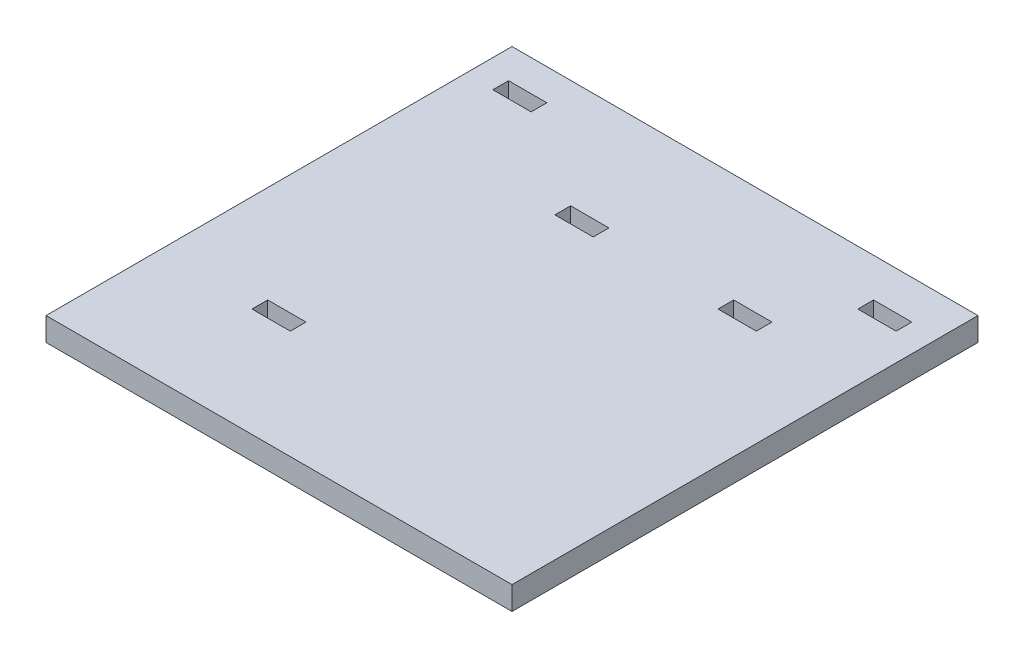
ISO-10303-21;
HEADER;
FILE_DESCRIPTION(('STEP AP214'),'2;1');
FILE_NAME('part.step','',(''),(''),'','','');
FILE_SCHEMA(('AUTOMOTIVE_DESIGN { 1 0 10303 214 1 1 1 1 }'));
ENDSEC;
DATA;
#1=APPLICATION_CONTEXT('core data for automotive mechanical design processes');
#2=APPLICATION_PROTOCOL_DEFINITION('international standard','automotive_design',2000,#1);
#3=PRODUCT_CONTEXT('',#1,'mechanical');
#4=PRODUCT('Part','Part','',(#3));
#5=PRODUCT_RELATED_PRODUCT_CATEGORY('part','',(#4));
#6=PRODUCT_DEFINITION_FORMATION('','',#4);
#7=PRODUCT_DEFINITION_CONTEXT('part definition',#1,'design');
#8=PRODUCT_DEFINITION('design','',#6,#7);
#9=PRODUCT_DEFINITION_SHAPE('','',#8);
#10=(LENGTH_UNIT() NAMED_UNIT(*) SI_UNIT(.MILLI.,.METRE.));
#11=(NAMED_UNIT(*) PLANE_ANGLE_UNIT() SI_UNIT($,.RADIAN.));
#12=(NAMED_UNIT(*) SI_UNIT($,.STERADIAN.) SOLID_ANGLE_UNIT());
#13=UNCERTAINTY_MEASURE_WITH_UNIT(LENGTH_MEASURE(1.E-05),#10,'distance_accuracy_value','');
#14=(GEOMETRIC_REPRESENTATION_CONTEXT(3) GLOBAL_UNCERTAINTY_ASSIGNED_CONTEXT((#13)) GLOBAL_UNIT_ASSIGNED_CONTEXT((#10,
#11,#12)) REPRESENTATION_CONTEXT('',''));
#15=CARTESIAN_POINT('',(0.,0.,0.));
#16=DIRECTION('',(0.,0.,1.));
#17=DIRECTION('',(1.,0.,0.));
#18=AXIS2_PLACEMENT_3D('',#15,#16,#17);
#19=CARTESIAN_POINT('',(-100.,10.,-100.));
#20=DIRECTION('',(1.,0.,0.));
#21=DIRECTION('',(0.,0.,-1.));
#22=AXIS2_PLACEMENT_3D('',#19,#20,#21);
#23=PLANE('',#22);
#24=DIRECTION('',(0.,0.,1.));
#25=VECTOR('',#24,1.);
#26=CARTESIAN_POINT('',(-100.,0.,-100.));
#27=LINE('',#26,#25);
#28=CARTESIAN_POINT('',(-100.,0.,-100.));
#29=VERTEX_POINT('',#28);
#30=CARTESIAN_POINT('',(-100.,0.,100.));
#31=VERTEX_POINT('',#30);
#32=EDGE_CURVE('E352',#29,#31,#27,.T.);
#33=ORIENTED_EDGE('',*,*,#32,.T.);
#34=DIRECTION('',(0.,-1.,0.));
#35=VECTOR('',#34,1.);
#36=CARTESIAN_POINT('',(-100.,10.,100.));
#37=LINE('',#36,#35);
#38=CARTESIAN_POINT('',(-100.,10.,100.));
#39=VERTEX_POINT('',#38);
#40=EDGE_CURVE('E11',#39,#31,#37,.T.);
#41=ORIENTED_EDGE('',*,*,#40,.F.);
#42=DIRECTION('',(0.,0.,1.));
#43=VECTOR('',#42,1.);
#44=CARTESIAN_POINT('',(-100.,10.,-100.));
#45=LINE('',#44,#43);
#46=CARTESIAN_POINT('',(-100.,10.,-100.));
#47=VERTEX_POINT('',#46);
#48=EDGE_CURVE('E359',#47,#39,#45,.T.);
#49=ORIENTED_EDGE('',*,*,#48,.F.);
#50=DIRECTION('',(0.,-1.,0.));
#51=VECTOR('',#50,1.);
#52=CARTESIAN_POINT('',(-100.,10.,-100.));
#53=LINE('',#52,#51);
#54=EDGE_CURVE('E369',#47,#29,#53,.T.);
#55=ORIENTED_EDGE('',*,*,#54,.T.);
#56=EDGE_LOOP('',(#33,#41,#49,#55));
#57=FACE_BOUND('',#56,.T.);
#58=ADVANCED_FACE('F33',(#57),#23,.F.);
#59=CARTESIAN_POINT('',(-100.,10.,100.));
#60=DIRECTION('',(0.,0.,-1.));
#61=DIRECTION('',(-1.,0.,0.));
#62=AXIS2_PLACEMENT_3D('',#59,#60,#61);
#63=PLANE('',#62);
#64=DIRECTION('',(1.,0.,0.));
#65=VECTOR('',#64,1.);
#66=CARTESIAN_POINT('',(-100.,0.,100.));
#67=LINE('',#66,#65);
#68=CARTESIAN_POINT('',(100.,0.,100.));
#69=VERTEX_POINT('',#68);
#70=EDGE_CURVE('E372',#31,#69,#67,.T.);
#71=ORIENTED_EDGE('',*,*,#70,.T.);
#72=DIRECTION('',(0.,-1.,0.));
#73=VECTOR('',#72,1.);
#74=CARTESIAN_POINT('',(100.,10.,100.));
#75=LINE('',#74,#73);
#76=CARTESIAN_POINT('',(100.,10.,100.));
#77=VERTEX_POINT('',#76);
#78=EDGE_CURVE('E40',#77,#69,#75,.T.);
#79=ORIENTED_EDGE('',*,*,#78,.F.);
#80=DIRECTION('',(1.,0.,0.));
#81=VECTOR('',#80,1.);
#82=CARTESIAN_POINT('',(-100.,10.,100.));
#83=LINE('',#82,#81);
#84=EDGE_CURVE('E362',#39,#77,#83,.T.);
#85=ORIENTED_EDGE('',*,*,#84,.F.);
#86=ORIENTED_EDGE('',*,*,#40,.T.);
#87=EDGE_LOOP('',(#71,#79,#85,#86));
#88=FACE_BOUND('',#87,.T.);
#89=ADVANCED_FACE('F401',(#88),#63,.F.);
#90=CARTESIAN_POINT('',(100.,10.,-100.));
#91=DIRECTION('',(-1.,0.,0.));
#92=DIRECTION('',(0.,0.,1.));
#93=AXIS2_PLACEMENT_3D('',#90,#91,#92);
#94=PLANE('',#93);
#95=DIRECTION('',(0.,0.,-1.));
#96=VECTOR('',#95,1.);
#97=CARTESIAN_POINT('',(100.,0.,-100.));
#98=LINE('',#97,#96);
#99=CARTESIAN_POINT('',(100.,0.,-100.));
#100=VERTEX_POINT('',#99);
#101=EDGE_CURVE('E374',#69,#100,#98,.T.);
#102=ORIENTED_EDGE('',*,*,#101,.T.);
#103=DIRECTION('',(0.,-1.,0.));
#104=VECTOR('',#103,1.);
#105=CARTESIAN_POINT('',(100.,10.,-100.));
#106=LINE('',#105,#104);
#107=CARTESIAN_POINT('',(100.,10.,-100.));
#108=VERTEX_POINT('',#107);
#109=EDGE_CURVE('E379',#108,#100,#106,.T.);
#110=ORIENTED_EDGE('',*,*,#109,.F.);
#111=DIRECTION('',(0.,0.,-1.));
#112=VECTOR('',#111,1.);
#113=CARTESIAN_POINT('',(100.,10.,-100.));
#114=LINE('',#113,#112);
#115=EDGE_CURVE('E365',#77,#108,#114,.T.);
#116=ORIENTED_EDGE('',*,*,#115,.F.);
#117=ORIENTED_EDGE('',*,*,#78,.T.);
#118=EDGE_LOOP('',(#102,#110,#116,#117));
#119=FACE_BOUND('',#118,.T.);
#120=ADVANCED_FACE('F386',(#119),#94,.F.);
#121=CARTESIAN_POINT('',(-100.,10.,-100.));
#122=DIRECTION('',(0.,0.,1.));
#123=DIRECTION('',(1.,0.,0.));
#124=AXIS2_PLACEMENT_3D('',#121,#122,#123);
#125=PLANE('',#124);
#126=DIRECTION('',(-1.,0.,0.));
#127=VECTOR('',#126,1.);
#128=CARTESIAN_POINT('',(-100.,0.,-100.));
#129=LINE('',#128,#127);
#130=EDGE_CURVE('E363',#100,#29,#129,.T.);
#131=ORIENTED_EDGE('',*,*,#130,.T.);
#132=ORIENTED_EDGE('',*,*,#54,.F.);
#133=DIRECTION('',(-1.,0.,0.));
#134=VECTOR('',#133,1.);
#135=CARTESIAN_POINT('',(-100.,10.,-100.));
#136=LINE('',#135,#134);
#137=EDGE_CURVE('E367',#108,#47,#136,.T.);
#138=ORIENTED_EDGE('',*,*,#137,.F.);
#139=ORIENTED_EDGE('',*,*,#109,.T.);
#140=EDGE_LOOP('',(#131,#132,#138,#139));
#141=FACE_BOUND('',#140,.T.);
#142=ADVANCED_FACE('F394',(#141),#125,.F.);
#143=CARTESIAN_POINT('',(0.,10.,0.));
#144=DIRECTION('',(0.,1.,0.));
#145=DIRECTION('',(0.,0.,1.));
#146=AXIS2_PLACEMENT_3D('',#143,#144,#145);
#147=PLANE('',#146);
#148=DIRECTION('',(0.,0.,1.));
#149=VECTOR('',#148,1.);
#150=CARTESIAN_POINT('',(71.7863811557623,10.,-83.3696897822514));
#151=LINE('',#150,#149);
#152=CARTESIAN_POINT('',(71.7863811557623,10.,-83.3696897822514));
#153=VERTEX_POINT('',#152);
#154=CARTESIAN_POINT('',(71.7863811557623,10.,-76.6303102177486));
#155=VERTEX_POINT('',#154);
#156=EDGE_CURVE('E47',#153,#155,#151,.T.);
#157=ORIENTED_EDGE('',*,*,#156,.F.);
#158=DIRECTION('',(-1.,0.,0.));
#159=VECTOR('',#158,1.);
#160=CARTESIAN_POINT('',(71.7863811557623,10.,-83.3696897822514));
#161=LINE('',#160,#159);
#162=CARTESIAN_POINT('',(88.2136188442377,10.,-83.3696897822514));
#163=VERTEX_POINT('',#162);
#164=EDGE_CURVE('E238',#163,#153,#161,.T.);
#165=ORIENTED_EDGE('',*,*,#164,.F.);
#166=DIRECTION('',(0.,0.,-1.));
#167=VECTOR('',#166,1.);
#168=CARTESIAN_POINT('',(88.2136188442377,10.,-83.3696897822514));
#169=LINE('',#168,#167);
#170=CARTESIAN_POINT('',(88.2136188442377,10.,-76.6303102177486));
#171=VERTEX_POINT('',#170);
#172=EDGE_CURVE('E252',#171,#163,#169,.T.);
#173=ORIENTED_EDGE('',*,*,#172,.F.);
#174=DIRECTION('',(1.,0.,0.));
#175=VECTOR('',#174,1.);
#176=CARTESIAN_POINT('',(71.7863811557623,10.,-76.6303102177486));
#177=LINE('',#176,#175);
#178=EDGE_CURVE('E249',#155,#171,#177,.T.);
#179=ORIENTED_EDGE('',*,*,#178,.F.);
#180=EDGE_LOOP('',(#157,#165,#173,#179));
#181=FACE_BOUND('',#180,.T.);
#182=DIRECTION('',(0.,0.,1.));
#183=VECTOR('',#182,1.);
#184=CARTESIAN_POINT('',(-58.2136188442377,10.,46.6303102177486));
#185=LINE('',#184,#183);
#186=CARTESIAN_POINT('',(-58.2136188442377,10.,46.6303102177486));
#187=VERTEX_POINT('',#186);
#188=CARTESIAN_POINT('',(-58.2136188442377,10.,53.3696897822514));
#189=VERTEX_POINT('',#188);
#190=EDGE_CURVE('E55',#187,#189,#185,.T.);
#191=ORIENTED_EDGE('',*,*,#190,.F.);
#192=DIRECTION('',(-1.,0.,0.));
#193=VECTOR('',#192,1.);
#194=CARTESIAN_POINT('',(-58.2136188442377,10.,46.6303102177486));
#195=LINE('',#194,#193);
#196=CARTESIAN_POINT('',(-41.7863811557623,10.,46.6303102177486));
#197=VERTEX_POINT('',#196);
#198=EDGE_CURVE('E214',#197,#187,#195,.T.);
#199=ORIENTED_EDGE('',*,*,#198,.F.);
#200=DIRECTION('',(0.,0.,-1.));
#201=VECTOR('',#200,1.);
#202=CARTESIAN_POINT('',(-41.7863811557623,10.,46.6303102177486));
#203=LINE('',#202,#201);
#204=CARTESIAN_POINT('',(-41.7863811557623,10.,53.3696897822514));
#205=VERTEX_POINT('',#204);
#206=EDGE_CURVE('E217',#205,#197,#203,.T.);
#207=ORIENTED_EDGE('',*,*,#206,.F.);
#208=DIRECTION('',(1.,0.,0.));
#209=VECTOR('',#208,1.);
#210=CARTESIAN_POINT('',(-58.2136188442377,10.,53.3696897822514));
#211=LINE('',#210,#209);
#212=EDGE_CURVE('E223',#189,#205,#211,.T.);
#213=ORIENTED_EDGE('',*,*,#212,.F.);
#214=EDGE_LOOP('',(#191,#199,#207,#213));
#215=FACE_BOUND('',#214,.T.);
#216=DIRECTION('',(0.,0.,1.));
#217=VECTOR('',#216,1.);
#218=CARTESIAN_POINT('',(41.7863811557623,10.,-53.3696897822514));
#219=LINE('',#218,#217);
#220=CARTESIAN_POINT('',(41.7863811557623,10.,-53.3696897822514));
#221=VERTEX_POINT('',#220);
#222=CARTESIAN_POINT('',(41.7863811557623,10.,-46.6303102177486));
#223=VERTEX_POINT('',#222);
#224=EDGE_CURVE('E230',#221,#223,#219,.T.);
#225=ORIENTED_EDGE('',*,*,#224,.F.);
#226=DIRECTION('',(-1.,0.,0.));
#227=VECTOR('',#226,1.);
#228=CARTESIAN_POINT('',(41.7863811557623,10.,-53.3696897822514));
#229=LINE('',#228,#227);
#230=CARTESIAN_POINT('',(58.2136188442377,10.,-53.3696897822514));
#231=VERTEX_POINT('',#230);
#232=EDGE_CURVE('E267',#231,#221,#229,.T.);
#233=ORIENTED_EDGE('',*,*,#232,.F.);
#234=DIRECTION('',(0.,0.,-1.));
#235=VECTOR('',#234,1.);
#236=CARTESIAN_POINT('',(58.2136188442377,10.,-53.3696897822514));
#237=LINE('',#236,#235);
#238=CARTESIAN_POINT('',(58.2136188442377,10.,-46.6303102177486));
#239=VERTEX_POINT('',#238);
#240=EDGE_CURVE('E281',#239,#231,#237,.T.);
#241=ORIENTED_EDGE('',*,*,#240,.F.);
#242=DIRECTION('',(1.,0.,0.));
#243=VECTOR('',#242,1.);
#244=CARTESIAN_POINT('',(41.7863811557623,10.,-46.6303102177486));
#245=LINE('',#244,#243);
#246=EDGE_CURVE('E278',#223,#239,#245,.T.);
#247=ORIENTED_EDGE('',*,*,#246,.F.);
#248=EDGE_LOOP('',(#225,#233,#241,#247));
#249=FACE_BOUND('',#248,.T.);
#250=DIRECTION('',(0.,0.,1.));
#251=VECTOR('',#250,1.);
#252=CARTESIAN_POINT('',(-28.2136188442377,10.,-53.3696897822514));
#253=LINE('',#252,#251);
#254=CARTESIAN_POINT('',(-28.2136188442377,10.,-53.3696897822514));
#255=VERTEX_POINT('',#254);
#256=CARTESIAN_POINT('',(-28.2136188442377,10.,-46.6303102177486));
#257=VERTEX_POINT('',#256);
#258=EDGE_CURVE('E288',#255,#257,#253,.T.);
#259=ORIENTED_EDGE('',*,*,#258,.F.);
#260=DIRECTION('',(-1.,0.,0.));
#261=VECTOR('',#260,1.);
#262=CARTESIAN_POINT('',(-28.2136188442377,10.,-53.3696897822514));
#263=LINE('',#262,#261);
#264=CARTESIAN_POINT('',(-11.7863811557623,10.,-53.3696897822514));
#265=VERTEX_POINT('',#264);
#266=EDGE_CURVE('E299',#265,#255,#263,.T.);
#267=ORIENTED_EDGE('',*,*,#266,.F.);
#268=DIRECTION('',(0.,0.,-1.));
#269=VECTOR('',#268,1.);
#270=CARTESIAN_POINT('',(-11.7863811557623,10.,-53.3696897822514));
#271=LINE('',#270,#269);
#272=CARTESIAN_POINT('',(-11.7863811557623,10.,-46.6303102177486));
#273=VERTEX_POINT('',#272);
#274=EDGE_CURVE('E313',#273,#265,#271,.T.);
#275=ORIENTED_EDGE('',*,*,#274,.F.);
#276=DIRECTION('',(1.,0.,0.));
#277=VECTOR('',#276,1.);
#278=CARTESIAN_POINT('',(-28.2136188442377,10.,-46.6303102177486));
#279=LINE('',#278,#277);
#280=EDGE_CURVE('E310',#257,#273,#279,.T.);
#281=ORIENTED_EDGE('',*,*,#280,.F.);
#282=EDGE_LOOP('',(#259,#267,#275,#281));
#283=FACE_BOUND('',#282,.T.);
#284=DIRECTION('',(0.,0.,1.));
#285=VECTOR('',#284,1.);
#286=CARTESIAN_POINT('',(-88.0331455613171,10.,-86.5589062815822));
#287=LINE('',#286,#285);
#288=CARTESIAN_POINT('',(-88.0331455613171,10.,-86.5589062815822));
#289=VERTEX_POINT('',#288);
#290=CARTESIAN_POINT('',(-88.0331455613171,10.,-79.8195267170794));
#291=VERTEX_POINT('',#290);
#292=EDGE_CURVE('E320',#289,#291,#287,.T.);
#293=ORIENTED_EDGE('',*,*,#292,.F.);
#294=DIRECTION('',(-1.,0.,0.));
#295=VECTOR('',#294,1.);
#296=CARTESIAN_POINT('',(-88.0331455613171,10.,-86.5589062815822));
#297=LINE('',#296,#295);
#298=CARTESIAN_POINT('',(-71.6059078728417,10.,-86.5589062815822));
#299=VERTEX_POINT('',#298);
#300=EDGE_CURVE('E331',#299,#289,#297,.T.);
#301=ORIENTED_EDGE('',*,*,#300,.F.);
#302=DIRECTION('',(0.,0.,-1.));
#303=VECTOR('',#302,1.);
#304=CARTESIAN_POINT('',(-71.6059078728417,10.,-86.5589062815822));
#305=LINE('',#304,#303);
#306=CARTESIAN_POINT('',(-71.6059078728417,10.,-79.8195267170794));
#307=VERTEX_POINT('',#306);
#308=EDGE_CURVE('E345',#307,#299,#305,.T.);
#309=ORIENTED_EDGE('',*,*,#308,.F.);
#310=DIRECTION('',(1.,0.,0.));
#311=VECTOR('',#310,1.);
#312=CARTESIAN_POINT('',(-88.0331455613171,10.,-79.8195267170794));
#313=LINE('',#312,#311);
#314=EDGE_CURVE('E342',#291,#307,#313,.T.);
#315=ORIENTED_EDGE('',*,*,#314,.F.);
#316=EDGE_LOOP('',(#293,#301,#309,#315));
#317=FACE_BOUND('',#316,.T.);
#318=ORIENTED_EDGE('',*,*,#48,.T.);
#319=ORIENTED_EDGE('',*,*,#84,.T.);
#320=ORIENTED_EDGE('',*,*,#115,.T.);
#321=ORIENTED_EDGE('',*,*,#137,.T.);
#322=EDGE_LOOP('',(#318,#319,#320,#321));
#323=FACE_BOUND('',#322,.T.);
#324=ADVANCED_FACE('F400',(#181,#215,#249,#283,#317,#323),#147,.T.);
#325=CARTESIAN_POINT('',(0.,0.,0.));
#326=DIRECTION('',(0.,1.,0.));
#327=DIRECTION('',(0.,0.,1.));
#328=AXIS2_PLACEMENT_3D('',#325,#326,#327);
#329=PLANE('',#328);
#330=DIRECTION('',(-1.,0.,0.));
#331=VECTOR('',#330,1.);
#332=CARTESIAN_POINT('',(71.7863811557623,0.,-83.3696897822514));
#333=LINE('',#332,#331);
#334=CARTESIAN_POINT('',(88.2136188442377,0.,-83.3696897822514));
#335=VERTEX_POINT('',#334);
#336=CARTESIAN_POINT('',(71.7863811557623,0.,-83.3696897822514));
#337=VERTEX_POINT('',#336);
#338=EDGE_CURVE('E244',#335,#337,#333,.T.);
#339=ORIENTED_EDGE('',*,*,#338,.T.);
#340=DIRECTION('',(0.,0.,1.));
#341=VECTOR('',#340,1.);
#342=CARTESIAN_POINT('',(71.7863811557623,0.,-83.3696897822514));
#343=LINE('',#342,#341);
#344=CARTESIAN_POINT('',(71.7863811557623,0.,-76.6303102177486));
#345=VERTEX_POINT('',#344);
#346=EDGE_CURVE('E234',#337,#345,#343,.T.);
#347=ORIENTED_EDGE('',*,*,#346,.T.);
#348=DIRECTION('',(1.,0.,0.));
#349=VECTOR('',#348,1.);
#350=CARTESIAN_POINT('',(71.7863811557623,0.,-76.6303102177486));
#351=LINE('',#350,#349);
#352=CARTESIAN_POINT('',(88.2136188442377,0.,-76.6303102177486));
#353=VERTEX_POINT('',#352);
#354=EDGE_CURVE('E237',#345,#353,#351,.T.);
#355=ORIENTED_EDGE('',*,*,#354,.T.);
#356=DIRECTION('',(0.,0.,-1.));
#357=VECTOR('',#356,1.);
#358=CARTESIAN_POINT('',(88.2136188442377,0.,-83.3696897822514));
#359=LINE('',#358,#357);
#360=EDGE_CURVE('E241',#353,#335,#359,.T.);
#361=ORIENTED_EDGE('',*,*,#360,.T.);
#362=EDGE_LOOP('',(#339,#347,#355,#361));
#363=FACE_BOUND('',#362,.T.);
#364=DIRECTION('',(-1.,0.,0.));
#365=VECTOR('',#364,1.);
#366=CARTESIAN_POINT('',(-58.2136188442377,0.,46.6303102177486));
#367=LINE('',#366,#365);
#368=CARTESIAN_POINT('',(-41.7863811557623,0.,46.6303102177486));
#369=VERTEX_POINT('',#368);
#370=CARTESIAN_POINT('',(-58.2136188442377,0.,46.6303102177486));
#371=VERTEX_POINT('',#370);
#372=EDGE_CURVE('E201',#369,#371,#367,.T.);
#373=ORIENTED_EDGE('',*,*,#372,.T.);
#374=DIRECTION('',(0.,0.,1.));
#375=VECTOR('',#374,1.);
#376=CARTESIAN_POINT('',(-58.2136188442377,0.,46.6303102177486));
#377=LINE('',#376,#375);
#378=CARTESIAN_POINT('',(-58.2136188442377,0.,53.3696897822514));
#379=VERTEX_POINT('',#378);
#380=EDGE_CURVE('E195',#371,#379,#377,.T.);
#381=ORIENTED_EDGE('',*,*,#380,.T.);
#382=DIRECTION('',(1.,0.,0.));
#383=VECTOR('',#382,1.);
#384=CARTESIAN_POINT('',(-58.2136188442377,0.,53.3696897822514));
#385=LINE('',#384,#383);
#386=CARTESIAN_POINT('',(-41.7863811557623,0.,53.3696897822514));
#387=VERTEX_POINT('',#386);
#388=EDGE_CURVE('E205',#379,#387,#385,.T.);
#389=ORIENTED_EDGE('',*,*,#388,.T.);
#390=DIRECTION('',(0.,0.,-1.));
#391=VECTOR('',#390,1.);
#392=CARTESIAN_POINT('',(-41.7863811557623,0.,46.6303102177486));
#393=LINE('',#392,#391);
#394=EDGE_CURVE('E209',#387,#369,#393,.T.);
#395=ORIENTED_EDGE('',*,*,#394,.T.);
#396=EDGE_LOOP('',(#373,#381,#389,#395));
#397=FACE_BOUND('',#396,.T.);
#398=DIRECTION('',(-1.,0.,0.));
#399=VECTOR('',#398,1.);
#400=CARTESIAN_POINT('',(41.7863811557623,0.,-53.3696897822514));
#401=LINE('',#400,#399);
#402=CARTESIAN_POINT('',(58.2136188442377,0.,-53.3696897822514));
#403=VERTEX_POINT('',#402);
#404=CARTESIAN_POINT('',(41.7863811557623,0.,-53.3696897822514));
#405=VERTEX_POINT('',#404);
#406=EDGE_CURVE('E273',#403,#405,#401,.T.);
#407=ORIENTED_EDGE('',*,*,#406,.T.);
#408=DIRECTION('',(0.,0.,1.));
#409=VECTOR('',#408,1.);
#410=CARTESIAN_POINT('',(41.7863811557623,0.,-53.3696897822514));
#411=LINE('',#410,#409);
#412=CARTESIAN_POINT('',(41.7863811557623,0.,-46.6303102177486));
#413=VERTEX_POINT('',#412);
#414=EDGE_CURVE('E263',#405,#413,#411,.T.);
#415=ORIENTED_EDGE('',*,*,#414,.T.);
#416=DIRECTION('',(1.,0.,0.));
#417=VECTOR('',#416,1.);
#418=CARTESIAN_POINT('',(41.7863811557623,0.,-46.6303102177486));
#419=LINE('',#418,#417);
#420=CARTESIAN_POINT('',(58.2136188442377,0.,-46.6303102177486));
#421=VERTEX_POINT('',#420);
#422=EDGE_CURVE('E266',#413,#421,#419,.T.);
#423=ORIENTED_EDGE('',*,*,#422,.T.);
#424=DIRECTION('',(0.,0.,-1.));
#425=VECTOR('',#424,1.);
#426=CARTESIAN_POINT('',(58.2136188442377,0.,-53.3696897822514));
#427=LINE('',#426,#425);
#428=EDGE_CURVE('E270',#421,#403,#427,.T.);
#429=ORIENTED_EDGE('',*,*,#428,.T.);
#430=EDGE_LOOP('',(#407,#415,#423,#429));
#431=FACE_BOUND('',#430,.T.);
#432=DIRECTION('',(-1.,0.,0.));
#433=VECTOR('',#432,1.);
#434=CARTESIAN_POINT('',(-28.2136188442377,0.,-53.3696897822514));
#435=LINE('',#434,#433);
#436=CARTESIAN_POINT('',(-11.7863811557623,0.,-53.3696897822514));
#437=VERTEX_POINT('',#436);
#438=CARTESIAN_POINT('',(-28.2136188442377,0.,-53.3696897822514));
#439=VERTEX_POINT('',#438);
#440=EDGE_CURVE('E305',#437,#439,#435,.T.);
#441=ORIENTED_EDGE('',*,*,#440,.T.);
#442=DIRECTION('',(0.,0.,1.));
#443=VECTOR('',#442,1.);
#444=CARTESIAN_POINT('',(-28.2136188442377,0.,-53.3696897822514));
#445=LINE('',#444,#443);
#446=CARTESIAN_POINT('',(-28.2136188442377,0.,-46.6303102177486));
#447=VERTEX_POINT('',#446);
#448=EDGE_CURVE('E295',#439,#447,#445,.T.);
#449=ORIENTED_EDGE('',*,*,#448,.T.);
#450=DIRECTION('',(1.,0.,0.));
#451=VECTOR('',#450,1.);
#452=CARTESIAN_POINT('',(-28.2136188442377,0.,-46.6303102177486));
#453=LINE('',#452,#451);
#454=CARTESIAN_POINT('',(-11.7863811557623,0.,-46.6303102177486));
#455=VERTEX_POINT('',#454);
#456=EDGE_CURVE('E298',#447,#455,#453,.T.);
#457=ORIENTED_EDGE('',*,*,#456,.T.);
#458=DIRECTION('',(0.,0.,-1.));
#459=VECTOR('',#458,1.);
#460=CARTESIAN_POINT('',(-11.7863811557623,0.,-53.3696897822514));
#461=LINE('',#460,#459);
#462=EDGE_CURVE('E302',#455,#437,#461,.T.);
#463=ORIENTED_EDGE('',*,*,#462,.T.);
#464=EDGE_LOOP('',(#441,#449,#457,#463));
#465=FACE_BOUND('',#464,.T.);
#466=DIRECTION('',(-1.,0.,0.));
#467=VECTOR('',#466,1.);
#468=CARTESIAN_POINT('',(-88.0331455613171,0.,-86.5589062815822));
#469=LINE('',#468,#467);
#470=CARTESIAN_POINT('',(-71.6059078728417,0.,-86.5589062815822));
#471=VERTEX_POINT('',#470);
#472=CARTESIAN_POINT('',(-88.0331455613171,0.,-86.5589062815822));
#473=VERTEX_POINT('',#472);
#474=EDGE_CURVE('E337',#471,#473,#469,.T.);
#475=ORIENTED_EDGE('',*,*,#474,.T.);
#476=DIRECTION('',(0.,0.,1.));
#477=VECTOR('',#476,1.);
#478=CARTESIAN_POINT('',(-88.0331455613171,0.,-86.5589062815822));
#479=LINE('',#478,#477);
#480=CARTESIAN_POINT('',(-88.0331455613171,0.,-79.8195267170794));
#481=VERTEX_POINT('',#480);
#482=EDGE_CURVE('E327',#473,#481,#479,.T.);
#483=ORIENTED_EDGE('',*,*,#482,.T.);
#484=DIRECTION('',(1.,0.,0.));
#485=VECTOR('',#484,1.);
#486=CARTESIAN_POINT('',(-88.0331455613171,0.,-79.8195267170794));
#487=LINE('',#486,#485);
#488=CARTESIAN_POINT('',(-71.6059078728417,0.,-79.8195267170794));
#489=VERTEX_POINT('',#488);
#490=EDGE_CURVE('E330',#481,#489,#487,.T.);
#491=ORIENTED_EDGE('',*,*,#490,.T.);
#492=DIRECTION('',(0.,0.,-1.));
#493=VECTOR('',#492,1.);
#494=CARTESIAN_POINT('',(-71.6059078728417,0.,-86.5589062815822));
#495=LINE('',#494,#493);
#496=EDGE_CURVE('E334',#489,#471,#495,.T.);
#497=ORIENTED_EDGE('',*,*,#496,.T.);
#498=EDGE_LOOP('',(#475,#483,#491,#497));
#499=FACE_BOUND('',#498,.T.);
#500=ORIENTED_EDGE('',*,*,#32,.F.);
#501=ORIENTED_EDGE('',*,*,#130,.F.);
#502=ORIENTED_EDGE('',*,*,#101,.F.);
#503=ORIENTED_EDGE('',*,*,#70,.F.);
#504=EDGE_LOOP('',(#500,#501,#502,#503));
#505=FACE_BOUND('',#504,.T.);
#506=ADVANCED_FACE('F211',(#363,#397,#431,#465,#499,#505),#329,.F.);
#507=CARTESIAN_POINT('',(-88.0331455613171,0.,-86.5589062815822));
#508=DIRECTION('',(-1.,0.,0.));
#509=DIRECTION('',(0.,0.,1.));
#510=AXIS2_PLACEMENT_3D('',#507,#508,#509);
#511=PLANE('',#510);
#512=ORIENTED_EDGE('',*,*,#292,.T.);
#513=DIRECTION('',(0.,1.,0.));
#514=VECTOR('',#513,1.);
#515=CARTESIAN_POINT('',(-88.0331455613171,0.,-79.8195267170794));
#516=LINE('',#515,#514);
#517=EDGE_CURVE('E340',#481,#291,#516,.T.);
#518=ORIENTED_EDGE('',*,*,#517,.F.);
#519=ORIENTED_EDGE('',*,*,#482,.F.);
#520=DIRECTION('',(0.,1.,0.));
#521=VECTOR('',#520,1.);
#522=CARTESIAN_POINT('',(-88.0331455613171,0.,-86.5589062815822));
#523=LINE('',#522,#521);
#524=EDGE_CURVE('E350',#473,#289,#523,.T.);
#525=ORIENTED_EDGE('',*,*,#524,.T.);
#526=EDGE_LOOP('',(#512,#518,#519,#525));
#527=FACE_BOUND('',#526,.T.);
#528=ADVANCED_FACE('F413',(#527),#511,.F.);
#529=CARTESIAN_POINT('',(-88.0331455613171,0.,-86.5589062815822));
#530=DIRECTION('',(0.,0.,-1.));
#531=DIRECTION('',(-1.,0.,0.));
#532=AXIS2_PLACEMENT_3D('',#529,#530,#531);
#533=PLANE('',#532);
#534=ORIENTED_EDGE('',*,*,#300,.T.);
#535=ORIENTED_EDGE('',*,*,#524,.F.);
#536=ORIENTED_EDGE('',*,*,#474,.F.);
#537=DIRECTION('',(0.,1.,0.));
#538=VECTOR('',#537,1.);
#539=CARTESIAN_POINT('',(-71.6059078728417,0.,-86.5589062815822));
#540=LINE('',#539,#538);
#541=EDGE_CURVE('E353',#471,#299,#540,.T.);
#542=ORIENTED_EDGE('',*,*,#541,.T.);
#543=EDGE_LOOP('',(#534,#535,#536,#542));
#544=FACE_BOUND('',#543,.T.);
#545=ADVANCED_FACE('F420',(#544),#533,.F.);
#546=CARTESIAN_POINT('',(-71.6059078728417,0.,-86.5589062815822));
#547=DIRECTION('',(1.,0.,0.));
#548=DIRECTION('',(0.,0.,-1.));
#549=AXIS2_PLACEMENT_3D('',#546,#547,#548);
#550=PLANE('',#549);
#551=ORIENTED_EDGE('',*,*,#308,.T.);
#552=ORIENTED_EDGE('',*,*,#541,.F.);
#553=ORIENTED_EDGE('',*,*,#496,.F.);
#554=DIRECTION('',(0.,1.,0.));
#555=VECTOR('',#554,1.);
#556=CARTESIAN_POINT('',(-71.6059078728417,0.,-79.8195267170794));
#557=LINE('',#556,#555);
#558=EDGE_CURVE('E355',#489,#307,#557,.T.);
#559=ORIENTED_EDGE('',*,*,#558,.T.);
#560=EDGE_LOOP('',(#551,#552,#553,#559));
#561=FACE_BOUND('',#560,.T.);
#562=ADVANCED_FACE('F426',(#561),#550,.F.);
#563=CARTESIAN_POINT('',(-88.0331455613171,0.,-79.8195267170794));
#564=DIRECTION('',(0.,0.,1.));
#565=DIRECTION('',(1.,0.,0.));
#566=AXIS2_PLACEMENT_3D('',#563,#564,#565);
#567=PLANE('',#566);
#568=ORIENTED_EDGE('',*,*,#314,.T.);
#569=ORIENTED_EDGE('',*,*,#558,.F.);
#570=ORIENTED_EDGE('',*,*,#490,.F.);
#571=ORIENTED_EDGE('',*,*,#517,.T.);
#572=EDGE_LOOP('',(#568,#569,#570,#571));
#573=FACE_BOUND('',#572,.T.);
#574=ADVANCED_FACE('F422',(#573),#567,.F.);
#575=CARTESIAN_POINT('',(-28.2136188442377,0.,-53.3696897822514));
#576=DIRECTION('',(-1.,0.,0.));
#577=DIRECTION('',(0.,0.,1.));
#578=AXIS2_PLACEMENT_3D('',#575,#576,#577);
#579=PLANE('',#578);
#580=ORIENTED_EDGE('',*,*,#258,.T.);
#581=DIRECTION('',(0.,1.,0.));
#582=VECTOR('',#581,1.);
#583=CARTESIAN_POINT('',(-28.2136188442377,0.,-46.6303102177486));
#584=LINE('',#583,#582);
#585=EDGE_CURVE('E308',#447,#257,#584,.T.);
#586=ORIENTED_EDGE('',*,*,#585,.F.);
#587=ORIENTED_EDGE('',*,*,#448,.F.);
#588=DIRECTION('',(0.,1.,0.));
#589=VECTOR('',#588,1.);
#590=CARTESIAN_POINT('',(-28.2136188442377,0.,-53.3696897822514));
#591=LINE('',#590,#589);
#592=EDGE_CURVE('E318',#439,#255,#591,.T.);
#593=ORIENTED_EDGE('',*,*,#592,.T.);
#594=EDGE_LOOP('',(#580,#586,#587,#593));
#595=FACE_BOUND('',#594,.T.);
#596=ADVANCED_FACE('F425',(#595),#579,.F.);
#597=CARTESIAN_POINT('',(-28.2136188442377,0.,-53.3696897822514));
#598=DIRECTION('',(0.,0.,-1.));
#599=DIRECTION('',(-1.,0.,0.));
#600=AXIS2_PLACEMENT_3D('',#597,#598,#599);
#601=PLANE('',#600);
#602=ORIENTED_EDGE('',*,*,#266,.T.);
#603=ORIENTED_EDGE('',*,*,#592,.F.);
#604=ORIENTED_EDGE('',*,*,#440,.F.);
#605=DIRECTION('',(0.,1.,0.));
#606=VECTOR('',#605,1.);
#607=CARTESIAN_POINT('',(-11.7863811557623,0.,-53.3696897822514));
#608=LINE('',#607,#606);
#609=EDGE_CURVE('E321',#437,#265,#608,.T.);
#610=ORIENTED_EDGE('',*,*,#609,.T.);
#611=EDGE_LOOP('',(#602,#603,#604,#610));
#612=FACE_BOUND('',#611,.T.);
#613=ADVANCED_FACE('F436',(#612),#601,.F.);
#614=CARTESIAN_POINT('',(-11.7863811557623,0.,-53.3696897822514));
#615=DIRECTION('',(1.,0.,0.));
#616=DIRECTION('',(0.,0.,-1.));
#617=AXIS2_PLACEMENT_3D('',#614,#615,#616);
#618=PLANE('',#617);
#619=ORIENTED_EDGE('',*,*,#274,.T.);
#620=ORIENTED_EDGE('',*,*,#609,.F.);
#621=ORIENTED_EDGE('',*,*,#462,.F.);
#622=DIRECTION('',(0.,1.,0.));
#623=VECTOR('',#622,1.);
#624=CARTESIAN_POINT('',(-11.7863811557623,0.,-46.6303102177486));
#625=LINE('',#624,#623);
#626=EDGE_CURVE('E323',#455,#273,#625,.T.);
#627=ORIENTED_EDGE('',*,*,#626,.T.);
#628=EDGE_LOOP('',(#619,#620,#621,#627));
#629=FACE_BOUND('',#628,.T.);
#630=ADVANCED_FACE('F442',(#629),#618,.F.);
#631=CARTESIAN_POINT('',(-28.2136188442377,0.,-46.6303102177486));
#632=DIRECTION('',(0.,0.,1.));
#633=DIRECTION('',(1.,0.,0.));
#634=AXIS2_PLACEMENT_3D('',#631,#632,#633);
#635=PLANE('',#634);
#636=ORIENTED_EDGE('',*,*,#280,.T.);
#637=ORIENTED_EDGE('',*,*,#626,.F.);
#638=ORIENTED_EDGE('',*,*,#456,.F.);
#639=ORIENTED_EDGE('',*,*,#585,.T.);
#640=EDGE_LOOP('',(#636,#637,#638,#639));
#641=FACE_BOUND('',#640,.T.);
#642=ADVANCED_FACE('F438',(#641),#635,.F.);
#643=CARTESIAN_POINT('',(41.7863811557623,0.,-53.3696897822514));
#644=DIRECTION('',(-1.,0.,0.));
#645=DIRECTION('',(0.,0.,1.));
#646=AXIS2_PLACEMENT_3D('',#643,#644,#645);
#647=PLANE('',#646);
#648=ORIENTED_EDGE('',*,*,#224,.T.);
#649=DIRECTION('',(0.,1.,0.));
#650=VECTOR('',#649,1.);
#651=CARTESIAN_POINT('',(41.7863811557623,0.,-46.6303102177486));
#652=LINE('',#651,#650);
#653=EDGE_CURVE('E276',#413,#223,#652,.T.);
#654=ORIENTED_EDGE('',*,*,#653,.F.);
#655=ORIENTED_EDGE('',*,*,#414,.F.);
#656=DIRECTION('',(0.,1.,0.));
#657=VECTOR('',#656,1.);
#658=CARTESIAN_POINT('',(41.7863811557623,0.,-53.3696897822514));
#659=LINE('',#658,#657);
#660=EDGE_CURVE('E286',#405,#221,#659,.T.);
#661=ORIENTED_EDGE('',*,*,#660,.T.);
#662=EDGE_LOOP('',(#648,#654,#655,#661));
#663=FACE_BOUND('',#662,.T.);
#664=ADVANCED_FACE('F441',(#663),#647,.F.);
#665=CARTESIAN_POINT('',(41.7863811557623,0.,-53.3696897822514));
#666=DIRECTION('',(0.,0.,-1.));
#667=DIRECTION('',(-1.,0.,0.));
#668=AXIS2_PLACEMENT_3D('',#665,#666,#667);
#669=PLANE('',#668);
#670=ORIENTED_EDGE('',*,*,#232,.T.);
#671=ORIENTED_EDGE('',*,*,#660,.F.);
#672=ORIENTED_EDGE('',*,*,#406,.F.);
#673=DIRECTION('',(0.,1.,0.));
#674=VECTOR('',#673,1.);
#675=CARTESIAN_POINT('',(58.2136188442377,0.,-53.3696897822514));
#676=LINE('',#675,#674);
#677=EDGE_CURVE('E289',#403,#231,#676,.T.);
#678=ORIENTED_EDGE('',*,*,#677,.T.);
#679=EDGE_LOOP('',(#670,#671,#672,#678));
#680=FACE_BOUND('',#679,.T.);
#681=ADVANCED_FACE('F452',(#680),#669,.F.);
#682=CARTESIAN_POINT('',(58.2136188442377,0.,-53.3696897822514));
#683=DIRECTION('',(1.,0.,0.));
#684=DIRECTION('',(0.,0.,-1.));
#685=AXIS2_PLACEMENT_3D('',#682,#683,#684);
#686=PLANE('',#685);
#687=ORIENTED_EDGE('',*,*,#240,.T.);
#688=ORIENTED_EDGE('',*,*,#677,.F.);
#689=ORIENTED_EDGE('',*,*,#428,.F.);
#690=DIRECTION('',(0.,1.,0.));
#691=VECTOR('',#690,1.);
#692=CARTESIAN_POINT('',(58.2136188442377,0.,-46.6303102177486));
#693=LINE('',#692,#691);
#694=EDGE_CURVE('E291',#421,#239,#693,.T.);
#695=ORIENTED_EDGE('',*,*,#694,.T.);
#696=EDGE_LOOP('',(#687,#688,#689,#695));
#697=FACE_BOUND('',#696,.T.);
#698=ADVANCED_FACE('F457',(#697),#686,.F.);
#699=CARTESIAN_POINT('',(41.7863811557623,0.,-46.6303102177486));
#700=DIRECTION('',(0.,0.,1.));
#701=DIRECTION('',(1.,0.,0.));
#702=AXIS2_PLACEMENT_3D('',#699,#700,#701);
#703=PLANE('',#702);
#704=ORIENTED_EDGE('',*,*,#246,.T.);
#705=ORIENTED_EDGE('',*,*,#694,.F.);
#706=ORIENTED_EDGE('',*,*,#422,.F.);
#707=ORIENTED_EDGE('',*,*,#653,.T.);
#708=EDGE_LOOP('',(#704,#705,#706,#707));
#709=FACE_BOUND('',#708,.T.);
#710=ADVANCED_FACE('F454',(#709),#703,.F.);
#711=CARTESIAN_POINT('',(-58.2136188442377,0.,46.6303102177486));
#712=DIRECTION('',(-1.,0.,0.));
#713=DIRECTION('',(0.,0.,1.));
#714=AXIS2_PLACEMENT_3D('',#711,#712,#713);
#715=PLANE('',#714);
#716=ORIENTED_EDGE('',*,*,#190,.T.);
#717=DIRECTION('',(0.,1.,0.));
#718=VECTOR('',#717,1.);
#719=CARTESIAN_POINT('',(-58.2136188442377,0.,53.3696897822514));
#720=LINE('',#719,#718);
#721=EDGE_CURVE('E191',#379,#189,#720,.T.);
#722=ORIENTED_EDGE('',*,*,#721,.F.);
#723=ORIENTED_EDGE('',*,*,#380,.F.);
#724=DIRECTION('',(0.,1.,0.));
#725=VECTOR('',#724,1.);
#726=CARTESIAN_POINT('',(-58.2136188442377,0.,46.6303102177486));
#727=LINE('',#726,#725);
#728=EDGE_CURVE('E228',#371,#187,#727,.T.);
#729=ORIENTED_EDGE('',*,*,#728,.T.);
#730=EDGE_LOOP('',(#716,#722,#723,#729));
#731=FACE_BOUND('',#730,.T.);
#732=ADVANCED_FACE('F193',(#731),#715,.F.);
#733=CARTESIAN_POINT('',(-58.2136188442377,0.,46.6303102177486));
#734=DIRECTION('',(0.,0.,-1.));
#735=DIRECTION('',(-1.,0.,0.));
#736=AXIS2_PLACEMENT_3D('',#733,#734,#735);
#737=PLANE('',#736);
#738=ORIENTED_EDGE('',*,*,#198,.T.);
#739=ORIENTED_EDGE('',*,*,#728,.F.);
#740=ORIENTED_EDGE('',*,*,#372,.F.);
#741=DIRECTION('',(0.,1.,0.));
#742=VECTOR('',#741,1.);
#743=CARTESIAN_POINT('',(-41.7863811557623,0.,46.6303102177486));
#744=LINE('',#743,#742);
#745=EDGE_CURVE('E231',#369,#197,#744,.T.);
#746=ORIENTED_EDGE('',*,*,#745,.T.);
#747=EDGE_LOOP('',(#738,#739,#740,#746));
#748=FACE_BOUND('',#747,.T.);
#749=ADVANCED_FACE('F482',(#748),#737,.F.);
#750=CARTESIAN_POINT('',(-41.7863811557623,0.,46.6303102177486));
#751=DIRECTION('',(1.,0.,0.));
#752=DIRECTION('',(0.,0.,-1.));
#753=AXIS2_PLACEMENT_3D('',#750,#751,#752);
#754=PLANE('',#753);
#755=ORIENTED_EDGE('',*,*,#206,.T.);
#756=ORIENTED_EDGE('',*,*,#745,.F.);
#757=ORIENTED_EDGE('',*,*,#394,.F.);
#758=DIRECTION('',(0.,1.,0.));
#759=VECTOR('',#758,1.);
#760=CARTESIAN_POINT('',(-41.7863811557623,0.,53.3696897822514));
#761=LINE('',#760,#759);
#762=EDGE_CURVE('E200',#387,#205,#761,.T.);
#763=ORIENTED_EDGE('',*,*,#762,.T.);
#764=EDGE_LOOP('',(#755,#756,#757,#763));
#765=FACE_BOUND('',#764,.T.);
#766=ADVANCED_FACE('F485',(#765),#754,.F.);
#767=CARTESIAN_POINT('',(-58.2136188442377,0.,53.3696897822514));
#768=DIRECTION('',(0.,0.,1.));
#769=DIRECTION('',(1.,0.,0.));
#770=AXIS2_PLACEMENT_3D('',#767,#768,#769);
#771=PLANE('',#770);
#772=ORIENTED_EDGE('',*,*,#212,.T.);
#773=ORIENTED_EDGE('',*,*,#762,.F.);
#774=ORIENTED_EDGE('',*,*,#388,.F.);
#775=ORIENTED_EDGE('',*,*,#721,.T.);
#776=EDGE_LOOP('',(#772,#773,#774,#775));
#777=FACE_BOUND('',#776,.T.);
#778=ADVANCED_FACE('F206',(#777),#771,.F.);
#779=CARTESIAN_POINT('',(71.7863811557623,0.,-83.3696897822514));
#780=DIRECTION('',(-1.,0.,0.));
#781=DIRECTION('',(0.,0.,1.));
#782=AXIS2_PLACEMENT_3D('',#779,#780,#781);
#783=PLANE('',#782);
#784=ORIENTED_EDGE('',*,*,#156,.T.);
#785=DIRECTION('',(0.,1.,0.));
#786=VECTOR('',#785,1.);
#787=CARTESIAN_POINT('',(71.7863811557623,0.,-76.6303102177486));
#788=LINE('',#787,#786);
#789=EDGE_CURVE('E247',#345,#155,#788,.T.);
#790=ORIENTED_EDGE('',*,*,#789,.F.);
#791=ORIENTED_EDGE('',*,*,#346,.F.);
#792=DIRECTION('',(0.,1.,0.));
#793=VECTOR('',#792,1.);
#794=CARTESIAN_POINT('',(71.7863811557623,0.,-83.3696897822514));
#795=LINE('',#794,#793);
#796=EDGE_CURVE('E224',#337,#153,#795,.T.);
#797=ORIENTED_EDGE('',*,*,#796,.T.);
#798=EDGE_LOOP('',(#784,#790,#791,#797));
#799=FACE_BOUND('',#798,.T.);
#800=ADVANCED_FACE('F465',(#799),#783,.F.);
#801=CARTESIAN_POINT('',(71.7863811557623,0.,-83.3696897822514));
#802=DIRECTION('',(0.,0.,-1.));
#803=DIRECTION('',(-1.,0.,0.));
#804=AXIS2_PLACEMENT_3D('',#801,#802,#803);
#805=PLANE('',#804);
#806=ORIENTED_EDGE('',*,*,#164,.T.);
#807=ORIENTED_EDGE('',*,*,#796,.F.);
#808=ORIENTED_EDGE('',*,*,#338,.F.);
#809=DIRECTION('',(0.,1.,0.));
#810=VECTOR('',#809,1.);
#811=CARTESIAN_POINT('',(88.2136188442377,0.,-83.3696897822514));
#812=LINE('',#811,#810);
#813=EDGE_CURVE('E258',#335,#163,#812,.T.);
#814=ORIENTED_EDGE('',*,*,#813,.T.);
#815=EDGE_LOOP('',(#806,#807,#808,#814));
#816=FACE_BOUND('',#815,.T.);
#817=ADVANCED_FACE('F468',(#816),#805,.F.);
#818=CARTESIAN_POINT('',(88.2136188442377,0.,-83.3696897822514));
#819=DIRECTION('',(1.,0.,0.));
#820=DIRECTION('',(0.,0.,-1.));
#821=AXIS2_PLACEMENT_3D('',#818,#819,#820);
#822=PLANE('',#821);
#823=ORIENTED_EDGE('',*,*,#172,.T.);
#824=ORIENTED_EDGE('',*,*,#813,.F.);
#825=ORIENTED_EDGE('',*,*,#360,.F.);
#826=DIRECTION('',(0.,1.,0.));
#827=VECTOR('',#826,1.);
#828=CARTESIAN_POINT('',(88.2136188442377,0.,-76.6303102177486));
#829=LINE('',#828,#827);
#830=EDGE_CURVE('E260',#353,#171,#829,.T.);
#831=ORIENTED_EDGE('',*,*,#830,.T.);
#832=EDGE_LOOP('',(#823,#824,#825,#831));
#833=FACE_BOUND('',#832,.T.);
#834=ADVANCED_FACE('F472',(#833),#822,.F.);
#835=CARTESIAN_POINT('',(71.7863811557623,0.,-76.6303102177486));
#836=DIRECTION('',(0.,0.,1.));
#837=DIRECTION('',(1.,0.,0.));
#838=AXIS2_PLACEMENT_3D('',#835,#836,#837);
#839=PLANE('',#838);
#840=ORIENTED_EDGE('',*,*,#178,.T.);
#841=ORIENTED_EDGE('',*,*,#830,.F.);
#842=ORIENTED_EDGE('',*,*,#354,.F.);
#843=ORIENTED_EDGE('',*,*,#789,.T.);
#844=EDGE_LOOP('',(#840,#841,#842,#843));
#845=FACE_BOUND('',#844,.T.);
#846=ADVANCED_FACE('F469',(#845),#839,.F.);
#847=CLOSED_SHELL('',(#58,#89,#120,#142,#324,#506,#528,#545,#562,#574,#596,#613,#630,#642,#664,
#681,#698,#710,#732,#749,#766,#778,#800,#817,#834,#846));
#848=MANIFOLD_SOLID_BREP('B2',#847);
#849=ADVANCED_BREP_SHAPE_REPRESENTATION('',(#18,#848),#14);
#850=SHAPE_DEFINITION_REPRESENTATION(#9,#849);
ENDSEC;
END-ISO-10303-21;
